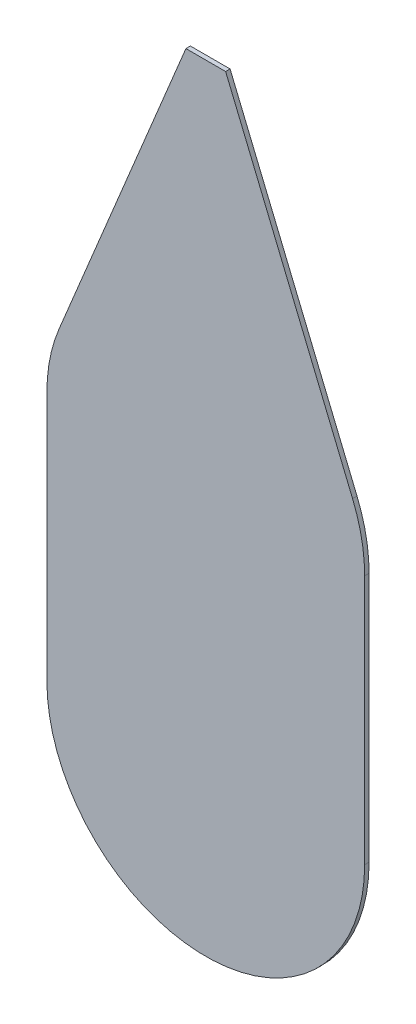
ISO-10303-21;
HEADER;
FILE_DESCRIPTION(('STEP AP214'),'2;1');
FILE_NAME('part.step','',(''),(''),'','','');
FILE_SCHEMA(('AUTOMOTIVE_DESIGN { 1 0 10303 214 1 1 1 1 }'));
ENDSEC;
DATA;
#1=APPLICATION_CONTEXT('core data for automotive mechanical design processes');
#2=APPLICATION_PROTOCOL_DEFINITION('international standard','automotive_design',2000,#1);
#3=PRODUCT_CONTEXT('',#1,'mechanical');
#4=PRODUCT('Part','Part','',(#3));
#5=PRODUCT_RELATED_PRODUCT_CATEGORY('part','',(#4));
#6=PRODUCT_DEFINITION_FORMATION('','',#4);
#7=PRODUCT_DEFINITION_CONTEXT('part definition',#1,'design');
#8=PRODUCT_DEFINITION('design','',#6,#7);
#9=PRODUCT_DEFINITION_SHAPE('','',#8);
#10=(LENGTH_UNIT() NAMED_UNIT(*) SI_UNIT(.MILLI.,.METRE.));
#11=(NAMED_UNIT(*) PLANE_ANGLE_UNIT() SI_UNIT($,.RADIAN.));
#12=(NAMED_UNIT(*) SI_UNIT($,.STERADIAN.) SOLID_ANGLE_UNIT());
#13=UNCERTAINTY_MEASURE_WITH_UNIT(LENGTH_MEASURE(1.E-05),#10,'distance_accuracy_value','');
#14=(GEOMETRIC_REPRESENTATION_CONTEXT(3) GLOBAL_UNCERTAINTY_ASSIGNED_CONTEXT((#13)) GLOBAL_UNIT_ASSIGNED_CONTEXT((#10,
#11,#12)) REPRESENTATION_CONTEXT('',''));
#15=CARTESIAN_POINT('',(0.,0.,0.));
#16=DIRECTION('',(0.,0.,1.));
#17=DIRECTION('',(1.,0.,0.));
#18=AXIS2_PLACEMENT_3D('',#15,#16,#17);
#19=CARTESIAN_POINT('',(22.116511977875,15.1613542223868,-0.1778));
#20=DIRECTION('',(0.,0.,1.));
#21=DIRECTION('',(1.,0.,0.));
#22=AXIS2_PLACEMENT_3D('',#19,#20,#21);
#23=CYLINDRICAL_SURFACE('',#22,6.35);
#24=CARTESIAN_POINT('',(22.116511977875,15.1613542223868,0.));
#25=DIRECTION('',(0.,0.,1.));
#26=DIRECTION('',(1.,0.,0.));
#27=AXIS2_PLACEMENT_3D('',#24,#25,#26);
#28=CIRCLE('',#27,6.35);
#29=CARTESIAN_POINT('',(16.2498769464283,17.5913940179051,0.));
#30=VERTEX_POINT('',#29);
#31=CARTESIAN_POINT('',(15.766511977875,15.1613542223868,0.));
#32=VERTEX_POINT('',#31);
#33=EDGE_CURVE('E148',#30,#32,#28,.T.);
#34=ORIENTED_EDGE('',*,*,#33,.F.);
#35=DIRECTION('',(0.,0.,1.));
#36=VECTOR('',#35,1.);
#37=CARTESIAN_POINT('',(16.2498769464283,17.5913940179051,-0.1778));
#38=LINE('',#37,#36);
#39=CARTESIAN_POINT('',(16.2498769464283,17.5913940179051,-0.1778));
#40=VERTEX_POINT('',#39);
#41=EDGE_CURVE('E11',#40,#30,#38,.T.);
#42=ORIENTED_EDGE('',*,*,#41,.F.);
#43=CARTESIAN_POINT('',(22.116511977875,15.1613542223868,-0.1778));
#44=DIRECTION('',(0.,0.,1.));
#45=DIRECTION('',(1.,0.,0.));
#46=AXIS2_PLACEMENT_3D('',#43,#44,#45);
#47=CIRCLE('',#46,6.35);
#48=CARTESIAN_POINT('',(15.766511977875,15.1613542223868,-0.1778));
#49=VERTEX_POINT('',#48);
#50=EDGE_CURVE('E176',#40,#49,#47,.T.);
#51=ORIENTED_EDGE('',*,*,#50,.T.);
#52=DIRECTION('',(0.,0.,1.));
#53=VECTOR('',#52,1.);
#54=CARTESIAN_POINT('',(15.766511977875,15.1613542223868,-0.1778));
#55=LINE('',#54,#53);
#56=EDGE_CURVE('E48',#49,#32,#55,.T.);
#57=ORIENTED_EDGE('',*,*,#56,.T.);
#58=EDGE_LOOP('',(#34,#42,#51,#57));
#59=FACE_BOUND('',#58,.T.);
#60=ADVANCED_FACE('F45',(#59),#23,.T.);
#61=CARTESIAN_POINT('',(21.3227619778749,29.8384218611834,-0.1778));
#62=DIRECTION('',(-0.92387953251129,0.382683432365083,0.));
#63=DIRECTION('',(-0.382683432365083,-0.92387953251129,0.));
#64=AXIS2_PLACEMENT_3D('',#61,#62,#63);
#65=PLANE('',#64);
#66=DIRECTION('',(-0.382683432365083,-0.92387953251129,0.));
#67=VECTOR('',#66,1.);
#68=CARTESIAN_POINT('',(21.3227619778749,29.8384218611834,0.));
#69=LINE('',#68,#67);
#70=CARTESIAN_POINT('',(21.3227619778749,29.8384218611834,0.));
#71=VERTEX_POINT('',#70);
#72=EDGE_CURVE('E173',#71,#30,#69,.T.);
#73=ORIENTED_EDGE('',*,*,#72,.F.);
#74=DIRECTION('',(0.,0.,1.));
#75=VECTOR('',#74,1.);
#76=CARTESIAN_POINT('',(21.3227619778749,29.8384218611834,-0.1778));
#77=LINE('',#76,#75);
#78=CARTESIAN_POINT('',(21.3227619778749,29.8384218611834,-0.1778));
#79=VERTEX_POINT('',#78);
#80=EDGE_CURVE('E55',#79,#71,#77,.T.);
#81=ORIENTED_EDGE('',*,*,#80,.F.);
#82=DIRECTION('',(-0.382683432365083,-0.92387953251129,0.));
#83=VECTOR('',#82,1.);
#84=CARTESIAN_POINT('',(21.3227619778749,29.8384218611834,-0.1778));
#85=LINE('',#84,#83);
#86=EDGE_CURVE('E134',#79,#40,#85,.T.);
#87=ORIENTED_EDGE('',*,*,#86,.T.);
#88=ORIENTED_EDGE('',*,*,#41,.T.);
#89=EDGE_LOOP('',(#73,#81,#87,#88));
#90=FACE_BOUND('',#89,.T.);
#91=ADVANCED_FACE('F194',(#90),#65,.T.);
#92=CARTESIAN_POINT('',(22.910261977875,29.8384218611834,-0.1778));
#93=DIRECTION('',(0.,1.,0.));
#94=DIRECTION('',(0.,0.,1.));
#95=AXIS2_PLACEMENT_3D('',#92,#93,#94);
#96=PLANE('',#95);
#97=DIRECTION('',(-1.,0.,0.));
#98=VECTOR('',#97,1.);
#99=CARTESIAN_POINT('',(22.910261977875,29.8384218611834,0.));
#100=LINE('',#99,#98);
#101=CARTESIAN_POINT('',(22.910261977875,29.8384218611834,0.));
#102=VERTEX_POINT('',#101);
#103=EDGE_CURVE('E120',#102,#71,#100,.T.);
#104=ORIENTED_EDGE('',*,*,#103,.F.);
#105=DIRECTION('',(0.,0.,1.));
#106=VECTOR('',#105,1.);
#107=CARTESIAN_POINT('',(22.910261977875,29.8384218611834,-0.1778));
#108=LINE('',#107,#106);
#109=CARTESIAN_POINT('',(22.910261977875,29.8384218611834,-0.1778));
#110=VERTEX_POINT('',#109);
#111=EDGE_CURVE('E115',#110,#102,#108,.T.);
#112=ORIENTED_EDGE('',*,*,#111,.F.);
#113=DIRECTION('',(-1.,0.,0.));
#114=VECTOR('',#113,1.);
#115=CARTESIAN_POINT('',(22.910261977875,29.8384218611834,-0.1778));
#116=LINE('',#115,#114);
#117=EDGE_CURVE('E118',#110,#79,#116,.T.);
#118=ORIENTED_EDGE('',*,*,#117,.T.);
#119=ORIENTED_EDGE('',*,*,#80,.T.);
#120=EDGE_LOOP('',(#104,#112,#118,#119));
#121=FACE_BOUND('',#120,.T.);
#122=ADVANCED_FACE('F117',(#121),#96,.T.);
#123=CARTESIAN_POINT('',(22.910261977875,29.8384218611834,-0.1778));
#124=DIRECTION('',(0.923879532511289,0.382683432365085,0.));
#125=DIRECTION('',(-0.382683432365085,0.923879532511289,0.));
#126=AXIS2_PLACEMENT_3D('',#123,#124,#125);
#127=PLANE('',#126);
#128=DIRECTION('',(-0.382683432365085,0.923879532511289,0.));
#129=VECTOR('',#128,1.);
#130=CARTESIAN_POINT('',(22.910261977875,29.8384218611834,0.));
#131=LINE('',#130,#129);
#132=CARTESIAN_POINT('',(27.9831470093217,17.5913940179051,0.));
#133=VERTEX_POINT('',#132);
#134=EDGE_CURVE('E168',#133,#102,#131,.T.);
#135=ORIENTED_EDGE('',*,*,#134,.F.);
#136=DIRECTION('',(0.,0.,1.));
#137=VECTOR('',#136,1.);
#138=CARTESIAN_POINT('',(27.9831470093217,17.5913940179051,-0.1778));
#139=LINE('',#138,#137);
#140=CARTESIAN_POINT('',(27.9831470093217,17.5913940179051,-0.1778));
#141=VERTEX_POINT('',#140);
#142=EDGE_CURVE('E126',#141,#133,#139,.T.);
#143=ORIENTED_EDGE('',*,*,#142,.F.);
#144=DIRECTION('',(-0.382683432365085,0.923879532511289,0.));
#145=VECTOR('',#144,1.);
#146=CARTESIAN_POINT('',(22.910261977875,29.8384218611834,-0.1778));
#147=LINE('',#146,#145);
#148=EDGE_CURVE('E132',#141,#110,#147,.T.);
#149=ORIENTED_EDGE('',*,*,#148,.T.);
#150=ORIENTED_EDGE('',*,*,#111,.T.);
#151=EDGE_LOOP('',(#135,#143,#149,#150));
#152=FACE_BOUND('',#151,.T.);
#153=ADVANCED_FACE('F137',(#152),#127,.T.);
#154=CARTESIAN_POINT('',(22.116511977875,15.1613542223868,-0.1778));
#155=DIRECTION('',(0.,0.,1.));
#156=DIRECTION('',(1.,0.,0.));
#157=AXIS2_PLACEMENT_3D('',#154,#155,#156);
#158=CYLINDRICAL_SURFACE('',#157,6.35000000000003);
#159=CARTESIAN_POINT('',(22.116511977875,15.1613542223868,0.));
#160=DIRECTION('',(0.,0.,1.));
#161=DIRECTION('',(1.,0.,0.));
#162=AXIS2_PLACEMENT_3D('',#159,#160,#161);
#163=CIRCLE('',#162,6.35000000000003);
#164=CARTESIAN_POINT('',(28.466511977875,15.1613542223868,0.));
#165=VERTEX_POINT('',#164);
#166=EDGE_CURVE('E164',#165,#133,#163,.T.);
#167=ORIENTED_EDGE('',*,*,#166,.F.);
#168=DIRECTION('',(0.,0.,1.));
#169=VECTOR('',#168,1.);
#170=CARTESIAN_POINT('',(28.466511977875,15.1613542223868,-0.1778));
#171=LINE('',#170,#169);
#172=CARTESIAN_POINT('',(28.466511977875,15.1613542223868,-0.1778));
#173=VERTEX_POINT('',#172);
#174=EDGE_CURVE('E182',#173,#165,#171,.T.);
#175=ORIENTED_EDGE('',*,*,#174,.F.);
#176=CARTESIAN_POINT('',(22.116511977875,15.1613542223868,-0.1778));
#177=DIRECTION('',(0.,0.,1.));
#178=DIRECTION('',(1.,0.,0.));
#179=AXIS2_PLACEMENT_3D('',#176,#177,#178);
#180=CIRCLE('',#179,6.35000000000003);
#181=EDGE_CURVE('E139',#173,#141,#180,.T.);
#182=ORIENTED_EDGE('',*,*,#181,.T.);
#183=ORIENTED_EDGE('',*,*,#142,.T.);
#184=EDGE_LOOP('',(#167,#175,#182,#183));
#185=FACE_BOUND('',#184,.T.);
#186=ADVANCED_FACE('F207',(#185),#158,.T.);
#187=CARTESIAN_POINT('',(28.466511977875,5.16135422238684,-0.1778));
#188=DIRECTION('',(1.,0.,0.));
#189=DIRECTION('',(0.,0.,-1.));
#190=AXIS2_PLACEMENT_3D('',#187,#188,#189);
#191=PLANE('',#190);
#192=DIRECTION('',(0.,1.,0.));
#193=VECTOR('',#192,1.);
#194=CARTESIAN_POINT('',(28.466511977875,5.16135422238684,0.));
#195=LINE('',#194,#193);
#196=CARTESIAN_POINT('',(28.466511977875,5.16135422238684,0.));
#197=VERTEX_POINT('',#196);
#198=EDGE_CURVE('E160',#197,#165,#195,.T.);
#199=ORIENTED_EDGE('',*,*,#198,.F.);
#200=DIRECTION('',(0.,0.,1.));
#201=VECTOR('',#200,1.);
#202=CARTESIAN_POINT('',(28.466511977875,5.16135422238684,-0.1778));
#203=LINE('',#202,#201);
#204=CARTESIAN_POINT('',(28.466511977875,5.16135422238684,-0.1778));
#205=VERTEX_POINT('',#204);
#206=EDGE_CURVE('E185',#205,#197,#203,.T.);
#207=ORIENTED_EDGE('',*,*,#206,.F.);
#208=DIRECTION('',(0.,1.,0.));
#209=VECTOR('',#208,1.);
#210=CARTESIAN_POINT('',(28.466511977875,5.16135422238684,-0.1778));
#211=LINE('',#210,#209);
#212=EDGE_CURVE('E142',#205,#173,#211,.T.);
#213=ORIENTED_EDGE('',*,*,#212,.T.);
#214=ORIENTED_EDGE('',*,*,#174,.T.);
#215=EDGE_LOOP('',(#199,#207,#213,#214));
#216=FACE_BOUND('',#215,.T.);
#217=ADVANCED_FACE('F210',(#216),#191,.T.);
#218=CARTESIAN_POINT('',(22.116511977875,5.16135422238684,-0.1778));
#219=DIRECTION('',(0.,0.,1.));
#220=DIRECTION('',(1.,0.,0.));
#221=AXIS2_PLACEMENT_3D('',#218,#219,#220);
#222=CYLINDRICAL_SURFACE('',#221,6.35000000000001);
#223=CARTESIAN_POINT('',(22.116511977875,5.16135422238684,0.));
#224=DIRECTION('',(0.,0.,1.));
#225=DIRECTION('',(1.,0.,0.));
#226=AXIS2_PLACEMENT_3D('',#223,#224,#225);
#227=CIRCLE('',#226,6.35000000000001);
#228=CARTESIAN_POINT('',(15.7665119778749,5.16135422238684,0.));
#229=VERTEX_POINT('',#228);
#230=EDGE_CURVE('E156',#229,#197,#227,.T.);
#231=ORIENTED_EDGE('',*,*,#230,.F.);
#232=DIRECTION('',(0.,0.,1.));
#233=VECTOR('',#232,1.);
#234=CARTESIAN_POINT('',(15.7665119778749,5.16135422238684,-0.1778));
#235=LINE('',#234,#233);
#236=CARTESIAN_POINT('',(15.7665119778749,5.16135422238684,-0.1778));
#237=VERTEX_POINT('',#236);
#238=EDGE_CURVE('E187',#237,#229,#235,.T.);
#239=ORIENTED_EDGE('',*,*,#238,.F.);
#240=CARTESIAN_POINT('',(22.116511977875,5.16135422238684,-0.1778));
#241=DIRECTION('',(0.,0.,1.));
#242=DIRECTION('',(1.,0.,0.));
#243=AXIS2_PLACEMENT_3D('',#240,#241,#242);
#244=CIRCLE('',#243,6.35000000000001);
#245=EDGE_CURVE('E305',#237,#205,#244,.T.);
#246=ORIENTED_EDGE('',*,*,#245,.T.);
#247=ORIENTED_EDGE('',*,*,#206,.T.);
#248=EDGE_LOOP('',(#231,#239,#246,#247));
#249=FACE_BOUND('',#248,.T.);
#250=ADVANCED_FACE('F214',(#249),#222,.T.);
#251=CARTESIAN_POINT('',(15.766511977875,5.16135422238684,-0.1778));
#252=DIRECTION('',(-1.,0.,0.));
#253=DIRECTION('',(0.,0.,1.));
#254=AXIS2_PLACEMENT_3D('',#251,#252,#253);
#255=PLANE('',#254);
#256=DIRECTION('',(0.,-1.,0.));
#257=VECTOR('',#256,1.);
#258=CARTESIAN_POINT('',(15.766511977875,5.16135422238684,0.));
#259=LINE('',#258,#257);
#260=EDGE_CURVE('E152',#32,#229,#259,.T.);
#261=ORIENTED_EDGE('',*,*,#260,.F.);
#262=ORIENTED_EDGE('',*,*,#56,.F.);
#263=DIRECTION('',(0.,-1.,0.));
#264=VECTOR('',#263,1.);
#265=CARTESIAN_POINT('',(15.766511977875,5.16135422238684,-0.1778));
#266=LINE('',#265,#264);
#267=EDGE_CURVE('E308',#49,#237,#266,.T.);
#268=ORIENTED_EDGE('',*,*,#267,.T.);
#269=ORIENTED_EDGE('',*,*,#238,.T.);
#270=EDGE_LOOP('',(#261,#262,#268,#269));
#271=FACE_BOUND('',#270,.T.);
#272=ADVANCED_FACE('F191',(#271),#255,.T.);
#273=CARTESIAN_POINT('',(22.116511977875,15.1613542223868,-0.1778));
#274=DIRECTION('',(0.,0.,1.));
#275=DIRECTION('',(1.,0.,0.));
#276=AXIS2_PLACEMENT_3D('',#273,#274,#275);
#277=PLANE('',#276);
#278=ORIENTED_EDGE('',*,*,#50,.F.);
#279=ORIENTED_EDGE('',*,*,#86,.F.);
#280=ORIENTED_EDGE('',*,*,#117,.F.);
#281=ORIENTED_EDGE('',*,*,#148,.F.);
#282=ORIENTED_EDGE('',*,*,#181,.F.);
#283=ORIENTED_EDGE('',*,*,#212,.F.);
#284=ORIENTED_EDGE('',*,*,#245,.F.);
#285=ORIENTED_EDGE('',*,*,#267,.F.);
#286=EDGE_LOOP('',(#278,#279,#280,#281,#282,#283,#284,#285));
#287=FACE_BOUND('',#286,.T.);
#288=ADVANCED_FACE('F130',(#287),#277,.F.);
#289=CARTESIAN_POINT('',(22.116511977875,15.1613542223868,0.));
#290=DIRECTION('',(0.,0.,1.));
#291=DIRECTION('',(1.,0.,0.));
#292=AXIS2_PLACEMENT_3D('',#289,#290,#291);
#293=PLANE('',#292);
#294=ORIENTED_EDGE('',*,*,#33,.T.);
#295=ORIENTED_EDGE('',*,*,#260,.T.);
#296=ORIENTED_EDGE('',*,*,#230,.T.);
#297=ORIENTED_EDGE('',*,*,#198,.T.);
#298=ORIENTED_EDGE('',*,*,#166,.T.);
#299=ORIENTED_EDGE('',*,*,#134,.T.);
#300=ORIENTED_EDGE('',*,*,#103,.T.);
#301=ORIENTED_EDGE('',*,*,#72,.T.);
#302=EDGE_LOOP('',(#294,#295,#296,#297,#298,#299,#300,#301));
#303=FACE_BOUND('',#302,.T.);
#304=ADVANCED_FACE('F193',(#303),#293,.T.);
#305=CLOSED_SHELL('',(#60,#91,#122,#153,#186,#217,#250,#272,#288,#304));
#306=MANIFOLD_SOLID_BREP('B2',#305);
#307=ADVANCED_BREP_SHAPE_REPRESENTATION('',(#18,#306),#14);
#308=SHAPE_DEFINITION_REPRESENTATION(#9,#307);
ENDSEC;
END-ISO-10303-21;
